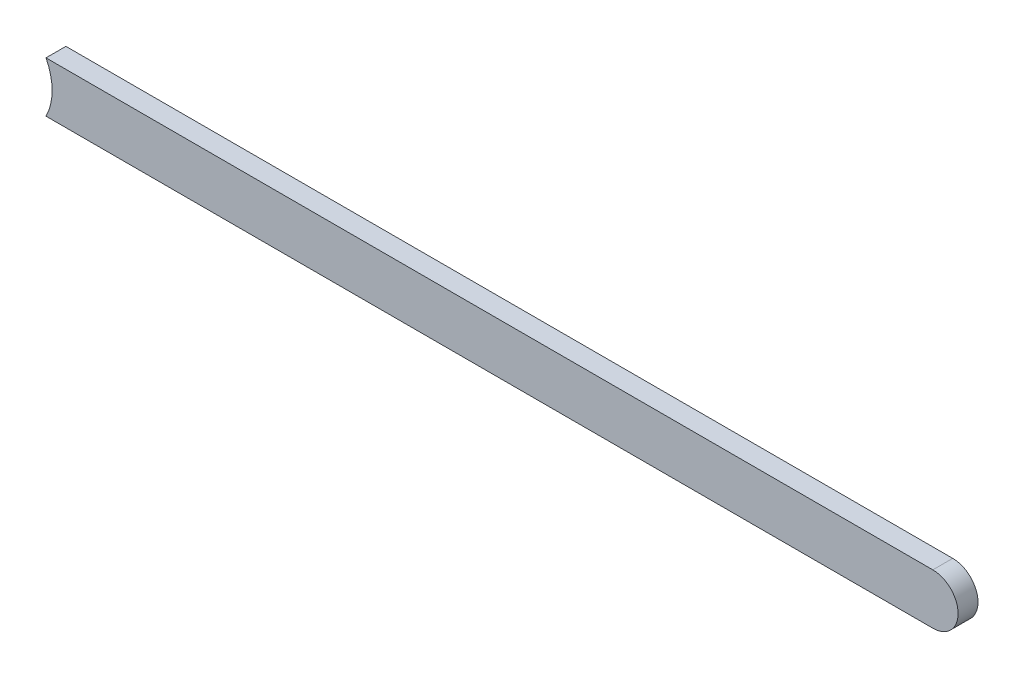
ISO-10303-21;
HEADER;
FILE_DESCRIPTION(('STEP AP214'),'2;1');
FILE_NAME('part.step','',(''),(''),'','','');
FILE_SCHEMA(('AUTOMOTIVE_DESIGN { 1 0 10303 214 1 1 1 1 }'));
ENDSEC;
DATA;
#1=APPLICATION_CONTEXT('core data for automotive mechanical design processes');
#2=APPLICATION_PROTOCOL_DEFINITION('international standard','automotive_design',2000,#1);
#3=PRODUCT_CONTEXT('',#1,'mechanical');
#4=PRODUCT('Part','Part','',(#3));
#5=PRODUCT_RELATED_PRODUCT_CATEGORY('part','',(#4));
#6=PRODUCT_DEFINITION_FORMATION('','',#4);
#7=PRODUCT_DEFINITION_CONTEXT('part definition',#1,'design');
#8=PRODUCT_DEFINITION('design','',#6,#7);
#9=PRODUCT_DEFINITION_SHAPE('','',#8);
#10=(LENGTH_UNIT() NAMED_UNIT(*) SI_UNIT(.MILLI.,.METRE.));
#11=(NAMED_UNIT(*) PLANE_ANGLE_UNIT() SI_UNIT($,.RADIAN.));
#12=(NAMED_UNIT(*) SI_UNIT($,.STERADIAN.) SOLID_ANGLE_UNIT());
#13=UNCERTAINTY_MEASURE_WITH_UNIT(LENGTH_MEASURE(1.E-05),#10,'distance_accuracy_value','');
#14=(GEOMETRIC_REPRESENTATION_CONTEXT(3) GLOBAL_UNCERTAINTY_ASSIGNED_CONTEXT((#13)) GLOBAL_UNIT_ASSIGNED_CONTEXT((#10,
#11,#12)) REPRESENTATION_CONTEXT('',''));
#15=CARTESIAN_POINT('',(0.,0.,0.));
#16=DIRECTION('',(0.,0.,1.));
#17=DIRECTION('',(1.,0.,0.));
#18=AXIS2_PLACEMENT_3D('',#15,#16,#17);
#19=CARTESIAN_POINT('',(114.278202090858,113.665,0.));
#20=DIRECTION('',(0.,1.,0.));
#21=DIRECTION('',(1.,0.,0.));
#22=AXIS2_PLACEMENT_3D('',#19,#20,#21);
#23=PLANE('',#22);
#24=DIRECTION('',(1.,0.,0.));
#25=VECTOR('',#24,1.);
#26=CARTESIAN_POINT('',(113.7847356,113.665,0.1999996));
#27=LINE('',#26,#25);
#28=CARTESIAN_POINT('',(114.278202090858,113.665,0.1999996));
#29=VERTEX_POINT('',#28);
#30=CARTESIAN_POINT('',(123.19,113.665,0.1999996));
#31=VERTEX_POINT('',#30);
#32=EDGE_CURVE('E11',#29,#31,#27,.T.);
#33=ORIENTED_EDGE('',*,*,#32,.F.);
#34=DIRECTION('',(0.,0.,1.));
#35=VECTOR('',#34,1.);
#36=CARTESIAN_POINT('',(114.278202090858,113.665,0.));
#37=LINE('',#36,#35);
#38=CARTESIAN_POINT('',(114.278202090858,113.665,0.));
#39=VERTEX_POINT('',#38);
#40=EDGE_CURVE('E24',#39,#29,#37,.T.);
#41=ORIENTED_EDGE('',*,*,#40,.F.);
#42=DIRECTION('',(1.,0.,0.));
#43=VECTOR('',#42,1.);
#44=CARTESIAN_POINT('',(113.7847356,113.665,0.));
#45=LINE('',#44,#43);
#46=CARTESIAN_POINT('',(123.19,113.665,0.));
#47=VERTEX_POINT('',#46);
#48=EDGE_CURVE('E82',#39,#47,#45,.T.);
#49=ORIENTED_EDGE('',*,*,#48,.T.);
#50=DIRECTION('',(0.,0.,1.));
#51=VECTOR('',#50,1.);
#52=CARTESIAN_POINT('',(123.19,113.665,0.));
#53=LINE('',#52,#51);
#54=EDGE_CURVE('E37',#47,#31,#53,.T.);
#55=ORIENTED_EDGE('',*,*,#54,.T.);
#56=EDGE_LOOP('',(#33,#41,#49,#55));
#57=FACE_BOUND('',#56,.T.);
#58=ADVANCED_FACE('F17',(#57),#23,.F.);
#59=CARTESIAN_POINT('',(123.19,113.919,0.));
#60=DIRECTION('',(0.,0.,-1.));
#61=DIRECTION('',(0.,-1.,0.));
#62=AXIS2_PLACEMENT_3D('',#59,#60,#61);
#63=CYLINDRICAL_SURFACE('',#62,0.253999999999995);
#64=CARTESIAN_POINT('',(123.19,113.919,0.1999996));
#65=DIRECTION('',(0.,0.,1.));
#66=DIRECTION('',(0.,-1.,0.));
#67=AXIS2_PLACEMENT_3D('',#64,#65,#66);
#68=CIRCLE('',#67,0.253999999999995);
#69=CARTESIAN_POINT('',(123.19,114.173,0.1999996));
#70=VERTEX_POINT('',#69);
#71=EDGE_CURVE('E97',#31,#70,#68,.T.);
#72=ORIENTED_EDGE('',*,*,#71,.F.);
#73=ORIENTED_EDGE('',*,*,#54,.F.);
#74=CARTESIAN_POINT('',(123.19,113.919,0.));
#75=DIRECTION('',(0.,0.,1.));
#76=DIRECTION('',(0.,-1.,0.));
#77=AXIS2_PLACEMENT_3D('',#74,#75,#76);
#78=CIRCLE('',#77,0.253999999999995);
#79=CARTESIAN_POINT('',(123.19,114.173,0.));
#80=VERTEX_POINT('',#79);
#81=EDGE_CURVE('E94',#47,#80,#78,.T.);
#82=ORIENTED_EDGE('',*,*,#81,.T.);
#83=DIRECTION('',(0.,0.,1.));
#84=VECTOR('',#83,1.);
#85=CARTESIAN_POINT('',(123.19,114.173,0.));
#86=LINE('',#85,#84);
#87=EDGE_CURVE('E92',#80,#70,#86,.T.);
#88=ORIENTED_EDGE('',*,*,#87,.T.);
#89=EDGE_LOOP('',(#72,#73,#82,#88));
#90=FACE_BOUND('',#89,.T.);
#91=ADVANCED_FACE('F103',(#90),#63,.T.);
#92=CARTESIAN_POINT('',(123.19,114.173,0.));
#93=DIRECTION('',(0.,-1.,0.));
#94=DIRECTION('',(-1.,0.,0.));
#95=AXIS2_PLACEMENT_3D('',#92,#93,#94);
#96=PLANE('',#95);
#97=DIRECTION('',(-1.,0.,0.));
#98=VECTOR('',#97,1.);
#99=CARTESIAN_POINT('',(123.19,114.173,0.1999996));
#100=LINE('',#99,#98);
#101=CARTESIAN_POINT('',(114.278202090858,114.173,0.1999996));
#102=VERTEX_POINT('',#101);
#103=EDGE_CURVE('E89',#70,#102,#100,.T.);
#104=ORIENTED_EDGE('',*,*,#103,.F.);
#105=ORIENTED_EDGE('',*,*,#87,.F.);
#106=DIRECTION('',(-1.,0.,0.));
#107=VECTOR('',#106,1.);
#108=CARTESIAN_POINT('',(123.19,114.173,0.));
#109=LINE('',#108,#107);
#110=CARTESIAN_POINT('',(114.278202090858,114.173,0.));
#111=VERTEX_POINT('',#110);
#112=EDGE_CURVE('E87',#80,#111,#109,.T.);
#113=ORIENTED_EDGE('',*,*,#112,.T.);
#114=DIRECTION('',(0.,0.,1.));
#115=VECTOR('',#114,1.);
#116=CARTESIAN_POINT('',(114.278202090858,114.173,0.));
#117=LINE('',#116,#115);
#118=EDGE_CURVE('E69',#111,#102,#117,.T.);
#119=ORIENTED_EDGE('',*,*,#118,.T.);
#120=EDGE_LOOP('',(#104,#105,#113,#119));
#121=FACE_BOUND('',#120,.T.);
#122=ADVANCED_FACE('F108',(#121),#96,.F.);
#123=CARTESIAN_POINT('',(113.7847356,113.919,0.));
#124=DIRECTION('',(0.,0.,-1.));
#125=DIRECTION('',(1.,0.,0.));
#126=AXIS2_PLACEMENT_3D('',#123,#124,#125);
#127=CYLINDRICAL_SURFACE('',#126,0.55500016);
#128=DIRECTION('',(0.,0.,1.));
#129=VECTOR('',#128,1.);
#130=CARTESIAN_POINT('',(114.33973576,113.919,0.));
#131=LINE('',#130,#129);
#132=CARTESIAN_POINT('',(114.33973576,113.919,0.));
#133=VERTEX_POINT('',#132);
#134=CARTESIAN_POINT('',(114.33973576,113.919,0.1999996));
#135=VERTEX_POINT('',#134);
#136=EDGE_CURVE('E59',#133,#135,#131,.T.);
#137=ORIENTED_EDGE('',*,*,#136,.T.);
#138=CARTESIAN_POINT('',(113.7847356,113.919,0.1999996));
#139=DIRECTION('',(0.,0.,1.));
#140=DIRECTION('',(1.,0.,0.));
#141=AXIS2_PLACEMENT_3D('',#138,#139,#140);
#142=CIRCLE('',#141,0.55500016);
#143=EDGE_CURVE('E70',#135,#102,#142,.T.);
#144=ORIENTED_EDGE('',*,*,#143,.T.);
#145=ORIENTED_EDGE('',*,*,#118,.F.);
#146=CARTESIAN_POINT('',(113.7847356,113.919,0.));
#147=DIRECTION('',(0.,0.,1.));
#148=DIRECTION('',(1.,0.,0.));
#149=AXIS2_PLACEMENT_3D('',#146,#147,#148);
#150=CIRCLE('',#149,0.55500016);
#151=EDGE_CURVE('E73',#133,#111,#150,.T.);
#152=ORIENTED_EDGE('',*,*,#151,.F.);
#153=EDGE_LOOP('',(#137,#144,#145,#152));
#154=FACE_BOUND('',#153,.T.);
#155=ADVANCED_FACE('F74',(#154),#127,.F.);
#156=CARTESIAN_POINT('',(113.7847356,113.919,0.));
#157=DIRECTION('',(0.,0.,-1.));
#158=DIRECTION('',(1.,0.,0.));
#159=AXIS2_PLACEMENT_3D('',#156,#157,#158);
#160=CYLINDRICAL_SURFACE('',#159,0.55500016);
#161=ORIENTED_EDGE('',*,*,#40,.T.);
#162=CARTESIAN_POINT('',(113.7847356,113.919,0.1999996));
#163=DIRECTION('',(0.,0.,1.));
#164=DIRECTION('',(1.,0.,0.));
#165=AXIS2_PLACEMENT_3D('',#162,#163,#164);
#166=CIRCLE('',#165,0.55500016);
#167=EDGE_CURVE('E65',#29,#135,#166,.T.);
#168=ORIENTED_EDGE('',*,*,#167,.T.);
#169=ORIENTED_EDGE('',*,*,#136,.F.);
#170=EDGE_CURVE('E63',#39,#133,#150,.T.);
#171=ORIENTED_EDGE('',*,*,#170,.F.);
#172=EDGE_LOOP('',(#161,#168,#169,#171));
#173=FACE_BOUND('',#172,.T.);
#174=ADVANCED_FACE('F61',(#173),#160,.F.);
#175=CARTESIAN_POINT('',(113.7847356,113.665,0.));
#176=DIRECTION('',(0.,0.,-1.));
#177=DIRECTION('',(-1.,0.,0.));
#178=AXIS2_PLACEMENT_3D('',#175,#176,#177);
#179=PLANE('',#178);
#180=ORIENTED_EDGE('',*,*,#48,.F.);
#181=ORIENTED_EDGE('',*,*,#170,.T.);
#182=ORIENTED_EDGE('',*,*,#151,.T.);
#183=ORIENTED_EDGE('',*,*,#112,.F.);
#184=ORIENTED_EDGE('',*,*,#81,.F.);
#185=EDGE_LOOP('',(#180,#181,#182,#183,#184));
#186=FACE_BOUND('',#185,.T.);
#187=ADVANCED_FACE('F80',(#186),#179,.T.);
#188=CARTESIAN_POINT('',(113.7847356,113.665,0.1999996));
#189=DIRECTION('',(0.,0.,-1.));
#190=DIRECTION('',(-1.,0.,0.));
#191=AXIS2_PLACEMENT_3D('',#188,#189,#190);
#192=PLANE('',#191);
#193=ORIENTED_EDGE('',*,*,#167,.F.);
#194=ORIENTED_EDGE('',*,*,#32,.T.);
#195=ORIENTED_EDGE('',*,*,#71,.T.);
#196=ORIENTED_EDGE('',*,*,#103,.T.);
#197=ORIENTED_EDGE('',*,*,#143,.F.);
#198=EDGE_LOOP('',(#193,#194,#195,#196,#197));
#199=FACE_BOUND('',#198,.T.);
#200=ADVANCED_FACE('F106',(#199),#192,.F.);
#201=CLOSED_SHELL('',(#58,#91,#122,#155,#174,#187,#200));
#202=MANIFOLD_SOLID_BREP('B1',#201);
#203=ADVANCED_BREP_SHAPE_REPRESENTATION('',(#18,#202),#14);
#204=SHAPE_DEFINITION_REPRESENTATION(#9,#203);
ENDSEC;
END-ISO-10303-21;
